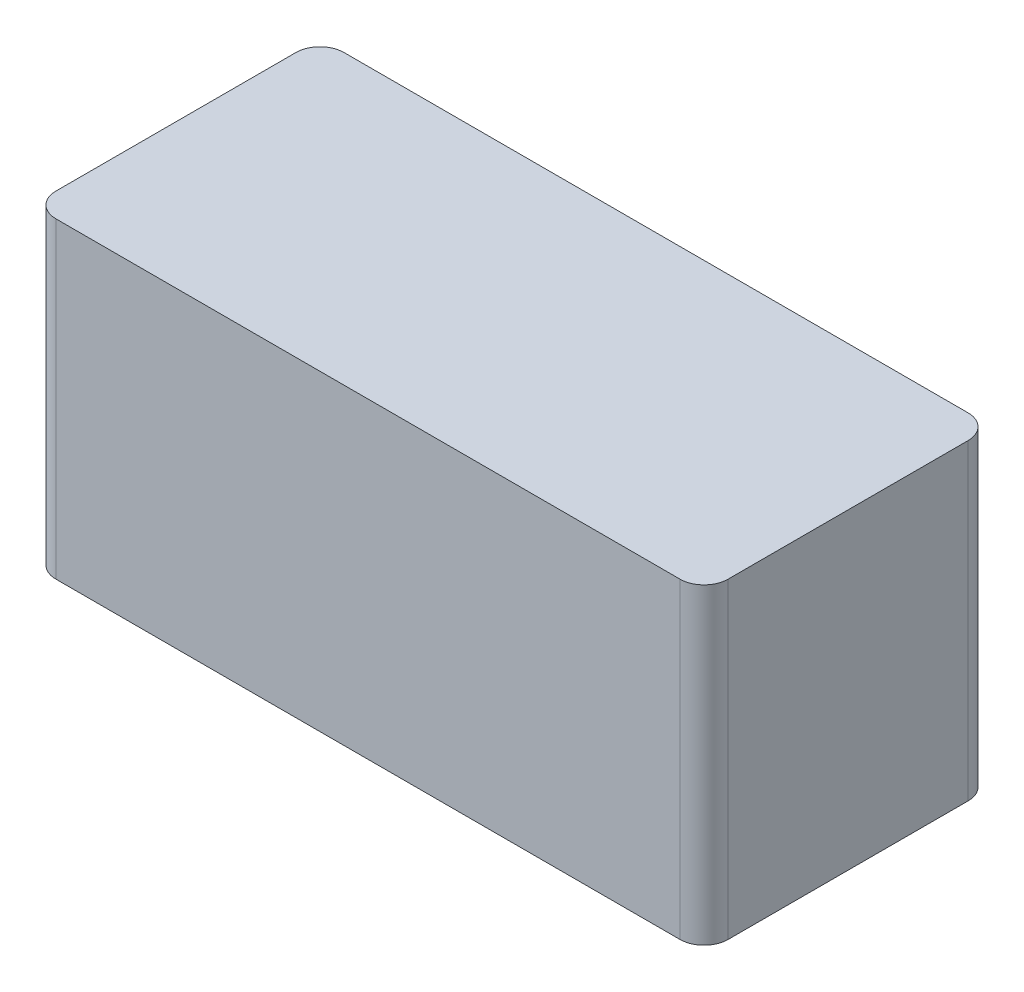
ISO-10303-21;
HEADER;
FILE_DESCRIPTION(('STEP AP214'),'2;1');
FILE_NAME('part.step','',(''),(''),'','','');
FILE_SCHEMA(('AUTOMOTIVE_DESIGN { 1 0 10303 214 1 1 1 1 }'));
ENDSEC;
DATA;
#1=APPLICATION_CONTEXT('core data for automotive mechanical design processes');
#2=APPLICATION_PROTOCOL_DEFINITION('international standard','automotive_design',2000,#1);
#3=PRODUCT_CONTEXT('',#1,'mechanical');
#4=PRODUCT('Part','Part','',(#3));
#5=PRODUCT_RELATED_PRODUCT_CATEGORY('part','',(#4));
#6=PRODUCT_DEFINITION_FORMATION('','',#4);
#7=PRODUCT_DEFINITION_CONTEXT('part definition',#1,'design');
#8=PRODUCT_DEFINITION('design','',#6,#7);
#9=PRODUCT_DEFINITION_SHAPE('','',#8);
#10=(LENGTH_UNIT() NAMED_UNIT(*) SI_UNIT(.MILLI.,.METRE.));
#11=(NAMED_UNIT(*) PLANE_ANGLE_UNIT() SI_UNIT($,.RADIAN.));
#12=(NAMED_UNIT(*) SI_UNIT($,.STERADIAN.) SOLID_ANGLE_UNIT());
#13=UNCERTAINTY_MEASURE_WITH_UNIT(LENGTH_MEASURE(1.E-05),#10,'distance_accuracy_value','');
#14=(GEOMETRIC_REPRESENTATION_CONTEXT(3) GLOBAL_UNCERTAINTY_ASSIGNED_CONTEXT((#13)) GLOBAL_UNIT_ASSIGNED_CONTEXT((#10,
#11,#12)) REPRESENTATION_CONTEXT('',''));
#15=CARTESIAN_POINT('',(0.,0.,0.));
#16=DIRECTION('',(0.,0.,1.));
#17=DIRECTION('',(1.,0.,0.));
#18=AXIS2_PLACEMENT_3D('',#15,#16,#17);
#19=CARTESIAN_POINT('',(70.,65.,30.));
#20=DIRECTION('',(-1.,0.,0.));
#21=DIRECTION('',(0.,0.,1.));
#22=AXIS2_PLACEMENT_3D('',#19,#20,#21);
#23=PLANE('',#22);
#24=DIRECTION('',(0.,0.,-1.));
#25=VECTOR('',#24,1.);
#26=CARTESIAN_POINT('',(70.,65.,30.));
#27=LINE('',#26,#25);
#28=CARTESIAN_POINT('',(70.,65.,25.));
#29=VERTEX_POINT('',#28);
#30=CARTESIAN_POINT('',(70.,65.,-25.));
#31=VERTEX_POINT('',#30);
#32=EDGE_CURVE('E121',#29,#31,#27,.T.);
#33=ORIENTED_EDGE('',*,*,#32,.F.);
#34=DIRECTION('',(0.,-1.,0.));
#35=VECTOR('',#34,1.);
#36=CARTESIAN_POINT('',(70.,65.,25.));
#37=LINE('',#36,#35);
#38=CARTESIAN_POINT('',(70.,0.,25.));
#39=VERTEX_POINT('',#38);
#40=EDGE_CURVE('E106',#29,#39,#37,.T.);
#41=ORIENTED_EDGE('',*,*,#40,.T.);
#42=DIRECTION('',(0.,0.,-1.));
#43=VECTOR('',#42,1.);
#44=CARTESIAN_POINT('',(70.,0.,30.));
#45=LINE('',#44,#43);
#46=CARTESIAN_POINT('',(70.,0.,-25.));
#47=VERTEX_POINT('',#46);
#48=EDGE_CURVE('E118',#39,#47,#45,.T.);
#49=ORIENTED_EDGE('',*,*,#48,.T.);
#50=DIRECTION('',(0.,-1.,0.));
#51=VECTOR('',#50,1.);
#52=CARTESIAN_POINT('',(70.,65.,-25.));
#53=LINE('',#52,#51);
#54=EDGE_CURVE('E123',#47,#31,#53,.F.);
#55=ORIENTED_EDGE('',*,*,#54,.T.);
#56=EDGE_LOOP('',(#33,#41,#49,#55));
#57=FACE_BOUND('',#56,.T.);
#58=ADVANCED_FACE('F37',(#57),#23,.F.);
#59=CARTESIAN_POINT('',(-70.,65.,-30.));
#60=DIRECTION('',(0.,0.,1.));
#61=DIRECTION('',(1.,0.,0.));
#62=AXIS2_PLACEMENT_3D('',#59,#60,#61);
#63=PLANE('',#62);
#64=DIRECTION('',(-1.,0.,0.));
#65=VECTOR('',#64,1.);
#66=CARTESIAN_POINT('',(-70.,65.,-30.));
#67=LINE('',#66,#65);
#68=CARTESIAN_POINT('',(65.,65.,-30.));
#69=VERTEX_POINT('',#68);
#70=CARTESIAN_POINT('',(-65.,65.,-30.));
#71=VERTEX_POINT('',#70);
#72=EDGE_CURVE('E172',#69,#71,#67,.T.);
#73=ORIENTED_EDGE('',*,*,#72,.F.);
#74=DIRECTION('',(0.,-1.,0.));
#75=VECTOR('',#74,1.);
#76=CARTESIAN_POINT('',(65.,65.,-30.));
#77=LINE('',#76,#75);
#78=CARTESIAN_POINT('',(65.,0.,-30.));
#79=VERTEX_POINT('',#78);
#80=EDGE_CURVE('E156',#69,#79,#77,.T.);
#81=ORIENTED_EDGE('',*,*,#80,.T.);
#82=DIRECTION('',(-1.,0.,0.));
#83=VECTOR('',#82,1.);
#84=CARTESIAN_POINT('',(-70.,0.,-30.));
#85=LINE('',#84,#83);
#86=CARTESIAN_POINT('',(-65.,0.,-30.));
#87=VERTEX_POINT('',#86);
#88=EDGE_CURVE('E127',#79,#87,#85,.T.);
#89=ORIENTED_EDGE('',*,*,#88,.T.);
#90=DIRECTION('',(0.,-1.,0.));
#91=VECTOR('',#90,1.);
#92=CARTESIAN_POINT('',(-65.,65.,-30.));
#93=LINE('',#92,#91);
#94=EDGE_CURVE('E154',#87,#71,#93,.F.);
#95=ORIENTED_EDGE('',*,*,#94,.T.);
#96=EDGE_LOOP('',(#73,#81,#89,#95));
#97=FACE_BOUND('',#96,.T.);
#98=ADVANCED_FACE('F182',(#97),#63,.F.);
#99=CARTESIAN_POINT('',(-70.,65.,30.));
#100=DIRECTION('',(1.,0.,0.));
#101=DIRECTION('',(0.,0.,-1.));
#102=AXIS2_PLACEMENT_3D('',#99,#100,#101);
#103=PLANE('',#102);
#104=DIRECTION('',(0.,0.,1.));
#105=VECTOR('',#104,1.);
#106=CARTESIAN_POINT('',(-70.,0.,30.));
#107=LINE('',#106,#105);
#108=CARTESIAN_POINT('',(-70.,0.,-25.));
#109=VERTEX_POINT('',#108);
#110=CARTESIAN_POINT('',(-70.,0.,25.));
#111=VERTEX_POINT('',#110);
#112=EDGE_CURVE('E130',#109,#111,#107,.T.);
#113=ORIENTED_EDGE('',*,*,#112,.T.);
#114=DIRECTION('',(0.,-1.,0.));
#115=VECTOR('',#114,1.);
#116=CARTESIAN_POINT('',(-70.,65.,25.));
#117=LINE('',#116,#115);
#118=CARTESIAN_POINT('',(-70.,65.,25.));
#119=VERTEX_POINT('',#118);
#120=EDGE_CURVE('E11',#111,#119,#117,.F.);
#121=ORIENTED_EDGE('',*,*,#120,.T.);
#122=DIRECTION('',(0.,0.,1.));
#123=VECTOR('',#122,1.);
#124=CARTESIAN_POINT('',(-70.,65.,30.));
#125=LINE('',#124,#123);
#126=CARTESIAN_POINT('',(-70.,65.,-25.));
#127=VERTEX_POINT('',#126);
#128=EDGE_CURVE('E162',#127,#119,#125,.T.);
#129=ORIENTED_EDGE('',*,*,#128,.F.);
#130=DIRECTION('',(0.,-1.,0.));
#131=VECTOR('',#130,1.);
#132=CARTESIAN_POINT('',(-70.,65.,-25.));
#133=LINE('',#132,#131);
#134=EDGE_CURVE('E45',#127,#109,#133,.T.);
#135=ORIENTED_EDGE('',*,*,#134,.T.);
#136=EDGE_LOOP('',(#113,#121,#129,#135));
#137=FACE_BOUND('',#136,.T.);
#138=ADVANCED_FACE('F161',(#137),#103,.F.);
#139=CARTESIAN_POINT('',(-70.,65.,30.));
#140=DIRECTION('',(0.,0.,-1.));
#141=DIRECTION('',(-1.,0.,0.));
#142=AXIS2_PLACEMENT_3D('',#139,#140,#141);
#143=PLANE('',#142);
#144=DIRECTION('',(1.,0.,0.));
#145=VECTOR('',#144,1.);
#146=CARTESIAN_POINT('',(-70.,0.,30.));
#147=LINE('',#146,#145);
#148=CARTESIAN_POINT('',(-65.,0.,30.));
#149=VERTEX_POINT('',#148);
#150=CARTESIAN_POINT('',(65.,0.,30.));
#151=VERTEX_POINT('',#150);
#152=EDGE_CURVE('E137',#149,#151,#147,.T.);
#153=ORIENTED_EDGE('',*,*,#152,.T.);
#154=DIRECTION('',(0.,-1.,0.));
#155=VECTOR('',#154,1.);
#156=CARTESIAN_POINT('',(65.,65.,30.));
#157=LINE('',#156,#155);
#158=CARTESIAN_POINT('',(65.,65.,30.));
#159=VERTEX_POINT('',#158);
#160=EDGE_CURVE('E107',#151,#159,#157,.F.);
#161=ORIENTED_EDGE('',*,*,#160,.T.);
#162=DIRECTION('',(1.,0.,0.));
#163=VECTOR('',#162,1.);
#164=CARTESIAN_POINT('',(-70.,65.,30.));
#165=LINE('',#164,#163);
#166=CARTESIAN_POINT('',(-65.,65.,30.));
#167=VERTEX_POINT('',#166);
#168=EDGE_CURVE('E133',#167,#159,#165,.T.);
#169=ORIENTED_EDGE('',*,*,#168,.F.);
#170=DIRECTION('',(0.,-1.,0.));
#171=VECTOR('',#170,1.);
#172=CARTESIAN_POINT('',(-65.,65.,30.));
#173=LINE('',#172,#171);
#174=EDGE_CURVE('E112',#167,#149,#173,.T.);
#175=ORIENTED_EDGE('',*,*,#174,.T.);
#176=EDGE_LOOP('',(#153,#161,#169,#175));
#177=FACE_BOUND('',#176,.T.);
#178=ADVANCED_FACE('F170',(#177),#143,.F.);
#179=CARTESIAN_POINT('',(0.,65.,0.));
#180=DIRECTION('',(0.,-1.,0.));
#181=DIRECTION('',(0.,0.,-1.));
#182=AXIS2_PLACEMENT_3D('',#179,#180,#181);
#183=PLANE('',#182);
#184=ORIENTED_EDGE('',*,*,#168,.T.);
#185=CARTESIAN_POINT('',(65.,65.,25.));
#186=DIRECTION('',(0.,-1.,0.));
#187=DIRECTION('',(0.,0.,-1.));
#188=AXIS2_PLACEMENT_3D('',#185,#186,#187);
#189=CIRCLE('',#188,5.);
#190=EDGE_CURVE('E152',#159,#29,#189,.F.);
#191=ORIENTED_EDGE('',*,*,#190,.T.);
#192=ORIENTED_EDGE('',*,*,#32,.T.);
#193=CARTESIAN_POINT('',(65.,65.,-25.));
#194=DIRECTION('',(0.,-1.,0.));
#195=DIRECTION('',(0.,0.,-1.));
#196=AXIS2_PLACEMENT_3D('',#193,#194,#195);
#197=CIRCLE('',#196,5.);
#198=EDGE_CURVE('E150',#31,#69,#197,.F.);
#199=ORIENTED_EDGE('',*,*,#198,.T.);
#200=ORIENTED_EDGE('',*,*,#72,.T.);
#201=CARTESIAN_POINT('',(-65.,65.,-25.));
#202=DIRECTION('',(0.,-1.,0.));
#203=DIRECTION('',(0.,0.,-1.));
#204=AXIS2_PLACEMENT_3D('',#201,#202,#203);
#205=CIRCLE('',#204,5.);
#206=EDGE_CURVE('E57',#71,#127,#205,.F.);
#207=ORIENTED_EDGE('',*,*,#206,.T.);
#208=ORIENTED_EDGE('',*,*,#128,.T.);
#209=CARTESIAN_POINT('',(-65.,65.,25.));
#210=DIRECTION('',(0.,-1.,0.));
#211=DIRECTION('',(0.,0.,-1.));
#212=AXIS2_PLACEMENT_3D('',#209,#210,#211);
#213=CIRCLE('',#212,5.);
#214=EDGE_CURVE('E148',#119,#167,#213,.F.);
#215=ORIENTED_EDGE('',*,*,#214,.T.);
#216=EDGE_LOOP('',(#184,#191,#192,#199,#200,#207,#208,#215));
#217=FACE_BOUND('',#216,.T.);
#218=ADVANCED_FACE('F176',(#217),#183,.F.);
#219=CARTESIAN_POINT('',(0.,0.,0.));
#220=DIRECTION('',(0.,-1.,0.));
#221=DIRECTION('',(0.,0.,-1.));
#222=AXIS2_PLACEMENT_3D('',#219,#220,#221);
#223=PLANE('',#222);
#224=ORIENTED_EDGE('',*,*,#48,.F.);
#225=CARTESIAN_POINT('',(65.,0.,25.));
#226=DIRECTION('',(0.,-1.,0.));
#227=DIRECTION('',(0.,0.,-1.));
#228=AXIS2_PLACEMENT_3D('',#225,#226,#227);
#229=CIRCLE('',#228,5.);
#230=EDGE_CURVE('E102',#39,#151,#229,.T.);
#231=ORIENTED_EDGE('',*,*,#230,.T.);
#232=ORIENTED_EDGE('',*,*,#152,.F.);
#233=CARTESIAN_POINT('',(-65.,0.,25.));
#234=DIRECTION('',(0.,-1.,0.));
#235=DIRECTION('',(0.,0.,-1.));
#236=AXIS2_PLACEMENT_3D('',#233,#234,#235);
#237=CIRCLE('',#236,5.);
#238=EDGE_CURVE('E141',#149,#111,#237,.T.);
#239=ORIENTED_EDGE('',*,*,#238,.T.);
#240=ORIENTED_EDGE('',*,*,#112,.F.);
#241=CARTESIAN_POINT('',(-65.,0.,-25.));
#242=DIRECTION('',(0.,-1.,0.));
#243=DIRECTION('',(0.,0.,-1.));
#244=AXIS2_PLACEMENT_3D('',#241,#242,#243);
#245=CIRCLE('',#244,5.);
#246=EDGE_CURVE('E122',#109,#87,#245,.T.);
#247=ORIENTED_EDGE('',*,*,#246,.T.);
#248=ORIENTED_EDGE('',*,*,#88,.F.);
#249=CARTESIAN_POINT('',(65.,0.,-25.));
#250=DIRECTION('',(0.,-1.,0.));
#251=DIRECTION('',(0.,0.,-1.));
#252=AXIS2_PLACEMENT_3D('',#249,#250,#251);
#253=CIRCLE('',#252,5.);
#254=EDGE_CURVE('E113',#79,#47,#253,.T.);
#255=ORIENTED_EDGE('',*,*,#254,.T.);
#256=EDGE_LOOP('',(#224,#231,#232,#239,#240,#247,#248,#255));
#257=FACE_BOUND('',#256,.T.);
#258=ADVANCED_FACE('F125',(#257),#223,.T.);
#259=CARTESIAN_POINT('',(65.,65.,25.));
#260=DIRECTION('',(0.,-1.,0.));
#261=DIRECTION('',(0.,0.,-1.));
#262=AXIS2_PLACEMENT_3D('',#259,#260,#261);
#263=CYLINDRICAL_SURFACE('',#262,5.);
#264=ORIENTED_EDGE('',*,*,#190,.F.);
#265=ORIENTED_EDGE('',*,*,#160,.F.);
#266=ORIENTED_EDGE('',*,*,#230,.F.);
#267=ORIENTED_EDGE('',*,*,#40,.F.);
#268=EDGE_LOOP('',(#264,#265,#266,#267));
#269=FACE_BOUND('',#268,.T.);
#270=ADVANCED_FACE('F105',(#269),#263,.T.);
#271=CARTESIAN_POINT('',(65.,65.,-25.));
#272=DIRECTION('',(0.,-1.,0.));
#273=DIRECTION('',(0.,0.,-1.));
#274=AXIS2_PLACEMENT_3D('',#271,#272,#273);
#275=CYLINDRICAL_SURFACE('',#274,5.);
#276=ORIENTED_EDGE('',*,*,#198,.F.);
#277=ORIENTED_EDGE('',*,*,#54,.F.);
#278=ORIENTED_EDGE('',*,*,#254,.F.);
#279=ORIENTED_EDGE('',*,*,#80,.F.);
#280=EDGE_LOOP('',(#276,#277,#278,#279));
#281=FACE_BOUND('',#280,.T.);
#282=ADVANCED_FACE('F180',(#281),#275,.T.);
#283=CARTESIAN_POINT('',(-65.,65.,25.));
#284=DIRECTION('',(0.,-1.,0.));
#285=DIRECTION('',(0.,0.,-1.));
#286=AXIS2_PLACEMENT_3D('',#283,#284,#285);
#287=CYLINDRICAL_SURFACE('',#286,5.);
#288=ORIENTED_EDGE('',*,*,#214,.F.);
#289=ORIENTED_EDGE('',*,*,#120,.F.);
#290=ORIENTED_EDGE('',*,*,#238,.F.);
#291=ORIENTED_EDGE('',*,*,#174,.F.);
#292=EDGE_LOOP('',(#288,#289,#290,#291));
#293=FACE_BOUND('',#292,.T.);
#294=ADVANCED_FACE('F167',(#293),#287,.T.);
#295=CARTESIAN_POINT('',(-65.,65.,-25.));
#296=DIRECTION('',(0.,-1.,0.));
#297=DIRECTION('',(0.,0.,-1.));
#298=AXIS2_PLACEMENT_3D('',#295,#296,#297);
#299=CYLINDRICAL_SURFACE('',#298,5.);
#300=ORIENTED_EDGE('',*,*,#206,.F.);
#301=ORIENTED_EDGE('',*,*,#94,.F.);
#302=ORIENTED_EDGE('',*,*,#246,.F.);
#303=ORIENTED_EDGE('',*,*,#134,.F.);
#304=EDGE_LOOP('',(#300,#301,#302,#303));
#305=FACE_BOUND('',#304,.T.);
#306=ADVANCED_FACE('F39',(#305),#299,.T.);
#307=CLOSED_SHELL('',(#58,#98,#138,#178,#218,#258,#270,#282,#294,#306));
#308=MANIFOLD_SOLID_BREP('B2',#307);
#309=ADVANCED_BREP_SHAPE_REPRESENTATION('',(#18,#308),#14);
#310=SHAPE_DEFINITION_REPRESENTATION(#9,#309);
ENDSEC;
END-ISO-10303-21;
